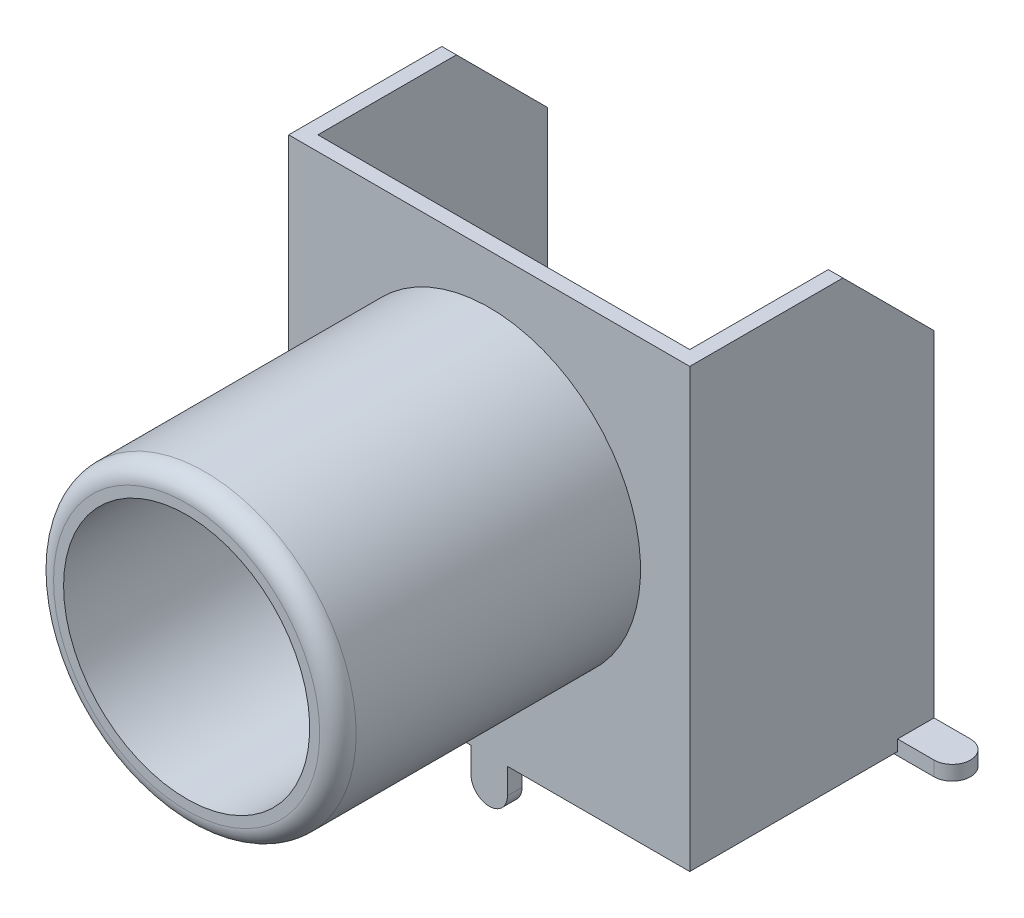
ISO-10303-21;
HEADER;
FILE_DESCRIPTION(('STEP AP214'),'2;1');
FILE_NAME('part.step','',(''),(''),'','','');
FILE_SCHEMA(('AUTOMOTIVE_DESIGN { 1 0 10303 214 1 1 1 1 }'));
ENDSEC;
DATA;
#1=APPLICATION_CONTEXT('core data for automotive mechanical design processes');
#2=APPLICATION_PROTOCOL_DEFINITION('international standard','automotive_design',2000,#1);
#3=PRODUCT_CONTEXT('',#1,'mechanical');
#4=PRODUCT('Part','Part','',(#3));
#5=PRODUCT_RELATED_PRODUCT_CATEGORY('part','',(#4));
#6=PRODUCT_DEFINITION_FORMATION('','',#4);
#7=PRODUCT_DEFINITION_CONTEXT('part definition',#1,'design');
#8=PRODUCT_DEFINITION('design','',#6,#7);
#9=PRODUCT_DEFINITION_SHAPE('','',#8);
#10=(LENGTH_UNIT() NAMED_UNIT(*) SI_UNIT(.MILLI.,.METRE.));
#11=(NAMED_UNIT(*) PLANE_ANGLE_UNIT() SI_UNIT($,.RADIAN.));
#12=(NAMED_UNIT(*) SI_UNIT($,.STERADIAN.) SOLID_ANGLE_UNIT());
#13=UNCERTAINTY_MEASURE_WITH_UNIT(LENGTH_MEASURE(1.E-05),#10,'distance_accuracy_value','');
#14=(GEOMETRIC_REPRESENTATION_CONTEXT(3) GLOBAL_UNCERTAINTY_ASSIGNED_CONTEXT((#13)) GLOBAL_UNIT_ASSIGNED_CONTEXT((#10,
#11,#12)) REPRESENTATION_CONTEXT('',''));
#15=CARTESIAN_POINT('',(0.,0.,0.));
#16=DIRECTION('',(0.,0.,1.));
#17=DIRECTION('',(1.,0.,0.));
#18=AXIS2_PLACEMENT_3D('',#15,#16,#17);
#19=CARTESIAN_POINT('',(6.5,5.5,-14.5));
#20=DIRECTION('',(0.,1.,0.));
#21=DIRECTION('',(0.,0.,1.));
#22=AXIS2_PLACEMENT_3D('',#19,#20,#21);
#23=CYLINDRICAL_SURFACE('',#22,0.5);
#24=DIRECTION('',(0.,1.,0.));
#25=VECTOR('',#24,1.);
#26=CARTESIAN_POINT('',(6.5,5.5,-15.));
#27=LINE('',#26,#25);
#28=CARTESIAN_POINT('',(6.5,-6.2,-15.));
#29=VERTEX_POINT('',#28);
#30=CARTESIAN_POINT('',(6.5,-6.6,-15.));
#31=VERTEX_POINT('',#30);
#32=EDGE_CURVE('E204',#29,#31,#27,.F.);
#33=ORIENTED_EDGE('',*,*,#32,.F.);
#34=CARTESIAN_POINT('',(6.5,-6.2,-14.5));
#35=DIRECTION('',(0.,1.,0.));
#36=DIRECTION('',(0.,0.,1.));
#37=AXIS2_PLACEMENT_3D('',#34,#35,#36);
#38=CIRCLE('',#37,0.5);
#39=CARTESIAN_POINT('',(6.5,-6.2,-14.));
#40=VERTEX_POINT('',#39);
#41=EDGE_CURVE('E188',#29,#40,#38,.F.);
#42=ORIENTED_EDGE('',*,*,#41,.T.);
#43=DIRECTION('',(0.,-1.,0.));
#44=VECTOR('',#43,1.);
#45=CARTESIAN_POINT('',(6.5,-6.2,-14.));
#46=LINE('',#45,#44);
#47=CARTESIAN_POINT('',(6.5,-6.6,-14.));
#48=VERTEX_POINT('',#47);
#49=EDGE_CURVE('E193',#48,#40,#46,.F.);
#50=ORIENTED_EDGE('',*,*,#49,.F.);
#51=CARTESIAN_POINT('',(6.5,-6.6,-14.5));
#52=DIRECTION('',(0.,1.,0.));
#53=DIRECTION('',(0.,0.,1.));
#54=AXIS2_PLACEMENT_3D('',#51,#52,#53);
#55=CIRCLE('',#54,0.5);
#56=EDGE_CURVE('E177',#31,#48,#55,.F.);
#57=ORIENTED_EDGE('',*,*,#56,.F.);
#58=EDGE_LOOP('',(#33,#42,#50,#57));
#59=FACE_BOUND('',#58,.T.);
#60=ADVANCED_FACE('F17',(#59),#23,.T.);
#61=CARTESIAN_POINT('',(5.1,-6.6,-15.));
#62=DIRECTION('',(0.,-1.,0.));
#63=DIRECTION('',(0.,0.,-1.));
#64=AXIS2_PLACEMENT_3D('',#61,#62,#63);
#65=PLANE('',#64);
#66=DIRECTION('',(-1.,0.,0.));
#67=VECTOR('',#66,1.);
#68=CARTESIAN_POINT('',(5.5,-6.6,-15.));
#69=LINE('',#68,#67);
#70=CARTESIAN_POINT('',(5.2,-6.6,-15.));
#71=VERTEX_POINT('',#70);
#72=EDGE_CURVE('E183',#31,#71,#69,.T.);
#73=ORIENTED_EDGE('',*,*,#72,.F.);
#74=ORIENTED_EDGE('',*,*,#56,.T.);
#75=DIRECTION('',(1.,0.,0.));
#76=VECTOR('',#75,1.);
#77=CARTESIAN_POINT('',(7.,-6.6,-14.));
#78=LINE('',#77,#76);
#79=CARTESIAN_POINT('',(5.2,-6.6,-14.));
#80=VERTEX_POINT('',#79);
#81=EDGE_CURVE('E181',#80,#48,#78,.T.);
#82=ORIENTED_EDGE('',*,*,#81,.F.);
#83=DIRECTION('',(0.,0.,1.));
#84=VECTOR('',#83,1.);
#85=CARTESIAN_POINT('',(5.2,-6.6,-15.));
#86=LINE('',#85,#84);
#87=EDGE_CURVE('E243',#71,#80,#86,.T.);
#88=ORIENTED_EDGE('',*,*,#87,.F.);
#89=EDGE_LOOP('',(#73,#74,#82,#88));
#90=FACE_BOUND('',#89,.T.);
#91=ADVANCED_FACE('F179',(#90),#65,.T.);
#92=CARTESIAN_POINT('',(5.1,-6.2,-15.));
#93=DIRECTION('',(0.,-1.,0.));
#94=DIRECTION('',(0.,0.,-1.));
#95=AXIS2_PLACEMENT_3D('',#92,#93,#94);
#96=PLANE('',#95);
#97=ORIENTED_EDGE('',*,*,#41,.F.);
#98=DIRECTION('',(-1.,0.,0.));
#99=VECTOR('',#98,1.);
#100=CARTESIAN_POINT('',(5.5,-6.2,-15.));
#101=LINE('',#100,#99);
#102=CARTESIAN_POINT('',(5.5,-6.2,-15.));
#103=VERTEX_POINT('',#102);
#104=EDGE_CURVE('E474',#103,#29,#101,.F.);
#105=ORIENTED_EDGE('',*,*,#104,.F.);
#106=DIRECTION('',(0.,0.,1.));
#107=VECTOR('',#106,1.);
#108=CARTESIAN_POINT('',(5.5,-6.2,-8.7));
#109=LINE('',#108,#107);
#110=CARTESIAN_POINT('',(5.5,-6.2,-14.));
#111=VERTEX_POINT('',#110);
#112=EDGE_CURVE('E482',#103,#111,#109,.T.);
#113=ORIENTED_EDGE('',*,*,#112,.T.);
#114=DIRECTION('',(1.,0.,0.));
#115=VECTOR('',#114,1.);
#116=CARTESIAN_POINT('',(7.,-6.2,-14.));
#117=LINE('',#116,#115);
#118=EDGE_CURVE('E200',#40,#111,#117,.F.);
#119=ORIENTED_EDGE('',*,*,#118,.F.);
#120=EDGE_LOOP('',(#97,#105,#113,#119));
#121=FACE_BOUND('',#120,.T.);
#122=ADVANCED_FACE('F529',(#121),#96,.F.);
#123=CARTESIAN_POINT('',(-5.1,-6.6,-15.));
#124=DIRECTION('',(0.,1.,0.));
#125=DIRECTION('',(0.,0.,1.));
#126=AXIS2_PLACEMENT_3D('',#123,#124,#125);
#127=PLANE('',#126);
#128=DIRECTION('',(0.,0.,1.));
#129=VECTOR('',#128,1.);
#130=CARTESIAN_POINT('',(-5.2,-6.6,-15.));
#131=LINE('',#130,#129);
#132=CARTESIAN_POINT('',(-5.2,-6.6,-14.));
#133=VERTEX_POINT('',#132);
#134=CARTESIAN_POINT('',(-5.2,-6.6,-15.));
#135=VERTEX_POINT('',#134);
#136=EDGE_CURVE('E239',#133,#135,#131,.F.);
#137=ORIENTED_EDGE('',*,*,#136,.F.);
#138=DIRECTION('',(1.,0.,0.));
#139=VECTOR('',#138,1.);
#140=CARTESIAN_POINT('',(-7.,-6.6,-14.));
#141=LINE('',#140,#139);
#142=CARTESIAN_POINT('',(-6.5,-6.6,-14.));
#143=VERTEX_POINT('',#142);
#144=EDGE_CURVE('E234',#143,#133,#141,.T.);
#145=ORIENTED_EDGE('',*,*,#144,.F.);
#146=CARTESIAN_POINT('',(-6.5,-6.6,-14.5));
#147=DIRECTION('',(0.,1.,0.));
#148=DIRECTION('',(0.,0.,1.));
#149=AXIS2_PLACEMENT_3D('',#146,#147,#148);
#150=CIRCLE('',#149,0.5);
#151=CARTESIAN_POINT('',(-6.5,-6.6,-15.));
#152=VERTEX_POINT('',#151);
#153=EDGE_CURVE('E246',#152,#143,#150,.T.);
#154=ORIENTED_EDGE('',*,*,#153,.F.);
#155=DIRECTION('',(-1.,0.,0.));
#156=VECTOR('',#155,1.);
#157=CARTESIAN_POINT('',(-5.5,-6.6,-15.));
#158=LINE('',#157,#156);
#159=EDGE_CURVE('E238',#135,#152,#158,.T.);
#160=ORIENTED_EDGE('',*,*,#159,.F.);
#161=EDGE_LOOP('',(#137,#145,#154,#160));
#162=FACE_BOUND('',#161,.T.);
#163=ADVANCED_FACE('F610',(#162),#127,.F.);
#164=CARTESIAN_POINT('',(-6.5,-6.2,-14.5));
#165=DIRECTION('',(0.,1.,0.));
#166=DIRECTION('',(0.,0.,1.));
#167=AXIS2_PLACEMENT_3D('',#164,#165,#166);
#168=CYLINDRICAL_SURFACE('',#167,0.5);
#169=CARTESIAN_POINT('',(-6.5,-6.2,-14.5));
#170=DIRECTION('',(0.,1.,0.));
#171=DIRECTION('',(0.,0.,1.));
#172=AXIS2_PLACEMENT_3D('',#169,#170,#171);
#173=CIRCLE('',#172,0.5);
#174=CARTESIAN_POINT('',(-6.5,-6.2,-15.));
#175=VERTEX_POINT('',#174);
#176=CARTESIAN_POINT('',(-6.5,-6.2,-14.));
#177=VERTEX_POINT('',#176);
#178=EDGE_CURVE('E197',#175,#177,#173,.T.);
#179=ORIENTED_EDGE('',*,*,#178,.F.);
#180=DIRECTION('',(0.,1.,0.));
#181=VECTOR('',#180,1.);
#182=CARTESIAN_POINT('',(-6.5,5.5,-15.));
#183=LINE('',#182,#181);
#184=EDGE_CURVE('E425',#152,#175,#183,.T.);
#185=ORIENTED_EDGE('',*,*,#184,.F.);
#186=ORIENTED_EDGE('',*,*,#153,.T.);
#187=DIRECTION('',(0.,1.,0.));
#188=VECTOR('',#187,1.);
#189=CARTESIAN_POINT('',(-6.5,-6.2,-14.));
#190=LINE('',#189,#188);
#191=EDGE_CURVE('E487',#177,#143,#190,.F.);
#192=ORIENTED_EDGE('',*,*,#191,.F.);
#193=EDGE_LOOP('',(#179,#185,#186,#192));
#194=FACE_BOUND('',#193,.T.);
#195=ADVANCED_FACE('F607',(#194),#168,.T.);
#196=CARTESIAN_POINT('',(-5.1,-6.2,-15.));
#197=DIRECTION('',(0.,1.,0.));
#198=DIRECTION('',(0.,0.,1.));
#199=AXIS2_PLACEMENT_3D('',#196,#197,#198);
#200=PLANE('',#199);
#201=DIRECTION('',(1.,0.,0.));
#202=VECTOR('',#201,1.);
#203=CARTESIAN_POINT('',(-7.,-6.2,-14.));
#204=LINE('',#203,#202);
#205=CARTESIAN_POINT('',(-5.5,-6.2,-14.));
#206=VERTEX_POINT('',#205);
#207=EDGE_CURVE('E233',#206,#177,#204,.F.);
#208=ORIENTED_EDGE('',*,*,#207,.F.);
#209=DIRECTION('',(0.,0.,-1.));
#210=VECTOR('',#209,1.);
#211=CARTESIAN_POINT('',(-5.5,-6.2,-8.7));
#212=LINE('',#211,#210);
#213=CARTESIAN_POINT('',(-5.5,-6.2,-15.));
#214=VERTEX_POINT('',#213);
#215=EDGE_CURVE('E396',#206,#214,#212,.T.);
#216=ORIENTED_EDGE('',*,*,#215,.T.);
#217=DIRECTION('',(-1.,0.,0.));
#218=VECTOR('',#217,1.);
#219=CARTESIAN_POINT('',(-5.5,-6.2,-15.));
#220=LINE('',#219,#218);
#221=EDGE_CURVE('E417',#175,#214,#220,.F.);
#222=ORIENTED_EDGE('',*,*,#221,.F.);
#223=ORIENTED_EDGE('',*,*,#178,.T.);
#224=EDGE_LOOP('',(#208,#216,#222,#223));
#225=FACE_BOUND('',#224,.T.);
#226=ADVANCED_FACE('F604',(#225),#200,.T.);
#227=CARTESIAN_POINT('',(7.,-6.2,-14.));
#228=DIRECTION('',(0.,0.,1.));
#229=DIRECTION('',(0.,-1.,0.));
#230=AXIS2_PLACEMENT_3D('',#227,#228,#229);
#231=PLANE('',#230);
#232=ORIENTED_EDGE('',*,*,#118,.T.);
#233=DIRECTION('',(0.,1.,0.));
#234=VECTOR('',#233,1.);
#235=CARTESIAN_POINT('',(5.5,5.5,-14.));
#236=LINE('',#235,#234);
#237=CARTESIAN_POINT('',(5.5,-6.5,-14.));
#238=VERTEX_POINT('',#237);
#239=EDGE_CURVE('E480',#111,#238,#236,.F.);
#240=ORIENTED_EDGE('',*,*,#239,.T.);
#241=DIRECTION('',(1.,0.,0.));
#242=VECTOR('',#241,1.);
#243=CARTESIAN_POINT('',(5.5,-6.5,-14.));
#244=LINE('',#243,#242);
#245=CARTESIAN_POINT('',(5.1,-6.5,-14.));
#246=VERTEX_POINT('',#245);
#247=EDGE_CURVE('E466',#238,#246,#244,.F.);
#248=ORIENTED_EDGE('',*,*,#247,.T.);
#249=CARTESIAN_POINT('',(5.2,-6.5,-14.));
#250=DIRECTION('',(0.,0.,1.));
#251=DIRECTION('',(1.,0.,0.));
#252=AXIS2_PLACEMENT_3D('',#249,#250,#251);
#253=CIRCLE('',#252,0.1);
#254=EDGE_CURVE('E196',#80,#246,#253,.F.);
#255=ORIENTED_EDGE('',*,*,#254,.F.);
#256=ORIENTED_EDGE('',*,*,#81,.T.);
#257=ORIENTED_EDGE('',*,*,#49,.T.);
#258=EDGE_LOOP('',(#232,#240,#248,#255,#256,#257));
#259=FACE_BOUND('',#258,.T.);
#260=ADVANCED_FACE('F192',(#259),#231,.T.);
#261=CARTESIAN_POINT('',(5.5,5.5,-15.));
#262=DIRECTION('',(0.,0.,-1.));
#263=DIRECTION('',(-1.,0.,0.));
#264=AXIS2_PLACEMENT_3D('',#261,#262,#263);
#265=PLANE('',#264);
#266=ORIENTED_EDGE('',*,*,#104,.T.);
#267=ORIENTED_EDGE('',*,*,#32,.T.);
#268=ORIENTED_EDGE('',*,*,#72,.T.);
#269=CARTESIAN_POINT('',(5.2,-6.5,-15.));
#270=DIRECTION('',(0.,0.,1.));
#271=DIRECTION('',(1.,0.,0.));
#272=AXIS2_PLACEMENT_3D('',#269,#270,#271);
#273=CIRCLE('',#272,0.1);
#274=CARTESIAN_POINT('',(5.1,-6.5,-15.));
#275=VERTEX_POINT('',#274);
#276=EDGE_CURVE('E240',#275,#71,#273,.T.);
#277=ORIENTED_EDGE('',*,*,#276,.F.);
#278=DIRECTION('',(0.,1.,0.));
#279=VECTOR('',#278,1.);
#280=CARTESIAN_POINT('',(5.1,5.5,-15.));
#281=LINE('',#280,#279);
#282=CARTESIAN_POINT('',(5.1,3.,-15.));
#283=VERTEX_POINT('',#282);
#284=EDGE_CURVE('E464',#283,#275,#281,.F.);
#285=ORIENTED_EDGE('',*,*,#284,.F.);
#286=DIRECTION('',(1.,0.,0.));
#287=VECTOR('',#286,1.);
#288=CARTESIAN_POINT('',(5.5,3.,-15.));
#289=LINE('',#288,#287);
#290=CARTESIAN_POINT('',(5.5,3.,-15.));
#291=VERTEX_POINT('',#290);
#292=EDGE_CURVE('E450',#291,#283,#289,.F.);
#293=ORIENTED_EDGE('',*,*,#292,.F.);
#294=DIRECTION('',(0.,1.,0.));
#295=VECTOR('',#294,1.);
#296=CARTESIAN_POINT('',(5.5,5.5,-15.));
#297=LINE('',#296,#295);
#298=EDGE_CURVE('E449',#291,#103,#297,.F.);
#299=ORIENTED_EDGE('',*,*,#298,.T.);
#300=EDGE_LOOP('',(#266,#267,#268,#277,#285,#293,#299));
#301=FACE_BOUND('',#300,.T.);
#302=ADVANCED_FACE('F525',(#301),#265,.T.);
#303=CARTESIAN_POINT('',(5.2,-6.5,-15.));
#304=DIRECTION('',(0.,0.,1.));
#305=DIRECTION('',(1.,0.,0.));
#306=AXIS2_PLACEMENT_3D('',#303,#304,#305);
#307=CYLINDRICAL_SURFACE('',#306,0.1);
#308=ORIENTED_EDGE('',*,*,#276,.T.);
#309=ORIENTED_EDGE('',*,*,#87,.T.);
#310=ORIENTED_EDGE('',*,*,#254,.T.);
#311=DIRECTION('',(0.,0.,1.));
#312=VECTOR('',#311,1.);
#313=CARTESIAN_POINT('',(5.1,-6.5,-15.));
#314=LINE('',#313,#312);
#315=EDGE_CURVE('E362',#275,#246,#314,.T.);
#316=ORIENTED_EDGE('',*,*,#315,.F.);
#317=EDGE_LOOP('',(#308,#309,#310,#316));
#318=FACE_BOUND('',#317,.T.);
#319=ADVANCED_FACE('F520',(#318),#307,.T.);
#320=CARTESIAN_POINT('',(5.5,3.,-15.));
#321=DIRECTION('',(0.,0.707106781186548,-0.707106781186548));
#322=DIRECTION('',(0.,0.707106781186548,0.707106781186548));
#323=AXIS2_PLACEMENT_3D('',#320,#321,#322);
#324=PLANE('',#323);
#325=DIRECTION('',(0.,-0.707106781186548,-0.707106781186547));
#326=VECTOR('',#325,1.);
#327=CARTESIAN_POINT('',(5.5,5.5,-12.5));
#328=LINE('',#327,#326);
#329=CARTESIAN_POINT('',(5.5,5.5,-12.5));
#330=VERTEX_POINT('',#329);
#331=EDGE_CURVE('E446',#330,#291,#328,.T.);
#332=ORIENTED_EDGE('',*,*,#331,.T.);
#333=ORIENTED_EDGE('',*,*,#292,.T.);
#334=DIRECTION('',(0.,-0.707106781186548,-0.707106781186547));
#335=VECTOR('',#334,1.);
#336=CARTESIAN_POINT('',(5.1,5.5,-12.5));
#337=LINE('',#336,#335);
#338=CARTESIAN_POINT('',(5.1,5.5,-12.5));
#339=VERTEX_POINT('',#338);
#340=EDGE_CURVE('E353',#339,#283,#337,.T.);
#341=ORIENTED_EDGE('',*,*,#340,.F.);
#342=DIRECTION('',(1.,0.,0.));
#343=VECTOR('',#342,1.);
#344=CARTESIAN_POINT('',(5.5,5.5,-12.5));
#345=LINE('',#344,#343);
#346=EDGE_CURVE('E457',#339,#330,#345,.T.);
#347=ORIENTED_EDGE('',*,*,#346,.T.);
#348=EDGE_LOOP('',(#332,#333,#341,#347));
#349=FACE_BOUND('',#348,.T.);
#350=ADVANCED_FACE('F555',(#349),#324,.T.);
#351=CARTESIAN_POINT('',(5.5,5.5,-8.7));
#352=DIRECTION('',(-1.,0.,0.));
#353=DIRECTION('',(0.,0.,1.));
#354=AXIS2_PLACEMENT_3D('',#351,#352,#353);
#355=PLANE('',#354);
#356=ORIENTED_EDGE('',*,*,#239,.F.);
#357=ORIENTED_EDGE('',*,*,#112,.F.);
#358=ORIENTED_EDGE('',*,*,#298,.F.);
#359=ORIENTED_EDGE('',*,*,#331,.F.);
#360=DIRECTION('',(0.,0.,-1.));
#361=VECTOR('',#360,1.);
#362=CARTESIAN_POINT('',(5.5,5.5,-8.7));
#363=LINE('',#362,#361);
#364=CARTESIAN_POINT('',(5.5,5.5,-8.3));
#365=VERTEX_POINT('',#364);
#366=EDGE_CURVE('E352',#330,#365,#363,.F.);
#367=ORIENTED_EDGE('',*,*,#366,.T.);
#368=DIRECTION('',(0.,1.,0.));
#369=VECTOR('',#368,1.);
#370=CARTESIAN_POINT('',(5.5,5.5,-8.3));
#371=LINE('',#370,#369);
#372=CARTESIAN_POINT('',(5.5,-6.5,-8.3));
#373=VERTEX_POINT('',#372);
#374=EDGE_CURVE('E405',#373,#365,#371,.T.);
#375=ORIENTED_EDGE('',*,*,#374,.F.);
#376=DIRECTION('',(0.,0.,1.));
#377=VECTOR('',#376,1.);
#378=CARTESIAN_POINT('',(5.5,-6.5,-8.7));
#379=LINE('',#378,#377);
#380=EDGE_CURVE('E368',#373,#238,#379,.F.);
#381=ORIENTED_EDGE('',*,*,#380,.T.);
#382=EDGE_LOOP('',(#356,#357,#358,#359,#367,#375,#381));
#383=FACE_BOUND('',#382,.T.);
#384=ADVANCED_FACE('F532',(#383),#355,.F.);
#385=CARTESIAN_POINT('',(-5.2,-6.5,-15.));
#386=DIRECTION('',(0.,0.,1.));
#387=DIRECTION('',(1.,0.,0.));
#388=AXIS2_PLACEMENT_3D('',#385,#386,#387);
#389=CYLINDRICAL_SURFACE('',#388,0.1);
#390=CARTESIAN_POINT('',(-5.2,-6.5,-14.));
#391=DIRECTION('',(0.,0.,1.));
#392=DIRECTION('',(1.,0.,0.));
#393=AXIS2_PLACEMENT_3D('',#390,#391,#392);
#394=CIRCLE('',#393,0.1);
#395=CARTESIAN_POINT('',(-5.1,-6.5,-14.));
#396=VERTEX_POINT('',#395);
#397=EDGE_CURVE('E231',#133,#396,#394,.T.);
#398=ORIENTED_EDGE('',*,*,#397,.F.);
#399=ORIENTED_EDGE('',*,*,#136,.T.);
#400=CARTESIAN_POINT('',(-5.2,-6.5,-15.));
#401=DIRECTION('',(0.,0.,1.));
#402=DIRECTION('',(1.,0.,0.));
#403=AXIS2_PLACEMENT_3D('',#400,#401,#402);
#404=CIRCLE('',#403,0.1);
#405=CARTESIAN_POINT('',(-5.1,-6.5,-15.));
#406=VERTEX_POINT('',#405);
#407=EDGE_CURVE('E235',#406,#135,#404,.F.);
#408=ORIENTED_EDGE('',*,*,#407,.F.);
#409=DIRECTION('',(0.,0.,-1.));
#410=VECTOR('',#409,1.);
#411=CARTESIAN_POINT('',(-5.1,-6.5,-15.));
#412=LINE('',#411,#410);
#413=EDGE_CURVE('E400',#396,#406,#412,.T.);
#414=ORIENTED_EDGE('',*,*,#413,.F.);
#415=EDGE_LOOP('',(#398,#399,#408,#414));
#416=FACE_BOUND('',#415,.T.);
#417=ADVANCED_FACE('F598',(#416),#389,.T.);
#418=CARTESIAN_POINT('',(-5.5,5.5,-15.));
#419=DIRECTION('',(0.,0.,-1.));
#420=DIRECTION('',(-1.,0.,0.));
#421=AXIS2_PLACEMENT_3D('',#418,#419,#420);
#422=PLANE('',#421);
#423=DIRECTION('',(0.,1.,0.));
#424=VECTOR('',#423,1.);
#425=CARTESIAN_POINT('',(-5.5,5.5,-15.));
#426=LINE('',#425,#424);
#427=CARTESIAN_POINT('',(-5.5,3.,-15.));
#428=VERTEX_POINT('',#427);
#429=EDGE_CURVE('E432',#214,#428,#426,.T.);
#430=ORIENTED_EDGE('',*,*,#429,.T.);
#431=DIRECTION('',(1.,0.,0.));
#432=VECTOR('',#431,1.);
#433=CARTESIAN_POINT('',(-5.5,3.,-15.));
#434=LINE('',#433,#432);
#435=CARTESIAN_POINT('',(-5.1,3.,-15.));
#436=VERTEX_POINT('',#435);
#437=EDGE_CURVE('E384',#436,#428,#434,.F.);
#438=ORIENTED_EDGE('',*,*,#437,.F.);
#439=DIRECTION('',(0.,1.,0.));
#440=VECTOR('',#439,1.);
#441=CARTESIAN_POINT('',(-5.1,5.5,-15.));
#442=LINE('',#441,#440);
#443=EDGE_CURVE('E402',#406,#436,#442,.T.);
#444=ORIENTED_EDGE('',*,*,#443,.F.);
#445=ORIENTED_EDGE('',*,*,#407,.T.);
#446=ORIENTED_EDGE('',*,*,#159,.T.);
#447=ORIENTED_EDGE('',*,*,#184,.T.);
#448=ORIENTED_EDGE('',*,*,#221,.T.);
#449=EDGE_LOOP('',(#430,#438,#444,#445,#446,#447,#448));
#450=FACE_BOUND('',#449,.T.);
#451=ADVANCED_FACE('F601',(#450),#422,.T.);
#452=CARTESIAN_POINT('',(-5.5,3.,-15.));
#453=DIRECTION('',(0.,0.707106781186548,-0.707106781186548));
#454=DIRECTION('',(0.,0.707106781186548,0.707106781186548));
#455=AXIS2_PLACEMENT_3D('',#452,#453,#454);
#456=PLANE('',#455);
#457=DIRECTION('',(0.,0.707106781186548,0.707106781186547));
#458=VECTOR('',#457,1.);
#459=CARTESIAN_POINT('',(-5.1,3.,-15.));
#460=LINE('',#459,#458);
#461=CARTESIAN_POINT('',(-5.1,5.5,-12.5));
#462=VERTEX_POINT('',#461);
#463=EDGE_CURVE('E342',#436,#462,#460,.T.);
#464=ORIENTED_EDGE('',*,*,#463,.F.);
#465=ORIENTED_EDGE('',*,*,#437,.T.);
#466=DIRECTION('',(0.,0.707106781186548,0.707106781186547));
#467=VECTOR('',#466,1.);
#468=CARTESIAN_POINT('',(-5.5,3.,-15.));
#469=LINE('',#468,#467);
#470=CARTESIAN_POINT('',(-5.5,5.5,-12.5));
#471=VERTEX_POINT('',#470);
#472=EDGE_CURVE('E397',#428,#471,#469,.T.);
#473=ORIENTED_EDGE('',*,*,#472,.T.);
#474=DIRECTION('',(1.,0.,0.));
#475=VECTOR('',#474,1.);
#476=CARTESIAN_POINT('',(5.5,5.5,-12.5));
#477=LINE('',#476,#475);
#478=EDGE_CURVE('E403',#471,#462,#477,.T.);
#479=ORIENTED_EDGE('',*,*,#478,.T.);
#480=EDGE_LOOP('',(#464,#465,#473,#479));
#481=FACE_BOUND('',#480,.T.);
#482=ADVANCED_FACE('F586',(#481),#456,.T.);
#483=CARTESIAN_POINT('',(-7.,-6.2,-14.));
#484=DIRECTION('',(0.,0.,1.));
#485=DIRECTION('',(1.,0.,0.));
#486=AXIS2_PLACEMENT_3D('',#483,#484,#485);
#487=PLANE('',#486);
#488=ORIENTED_EDGE('',*,*,#207,.T.);
#489=ORIENTED_EDGE('',*,*,#191,.T.);
#490=ORIENTED_EDGE('',*,*,#144,.T.);
#491=ORIENTED_EDGE('',*,*,#397,.T.);
#492=DIRECTION('',(1.,0.,0.));
#493=VECTOR('',#492,1.);
#494=CARTESIAN_POINT('',(5.5,-6.5,-14.));
#495=LINE('',#494,#493);
#496=CARTESIAN_POINT('',(-5.5,-6.5,-14.));
#497=VERTEX_POINT('',#496);
#498=EDGE_CURVE('E331',#396,#497,#495,.F.);
#499=ORIENTED_EDGE('',*,*,#498,.T.);
#500=DIRECTION('',(0.,1.,0.));
#501=VECTOR('',#500,1.);
#502=CARTESIAN_POINT('',(-5.5,5.5,-14.));
#503=LINE('',#502,#501);
#504=EDGE_CURVE('E393',#497,#206,#503,.T.);
#505=ORIENTED_EDGE('',*,*,#504,.T.);
#506=EDGE_LOOP('',(#488,#489,#490,#491,#499,#505));
#507=FACE_BOUND('',#506,.T.);
#508=ADVANCED_FACE('F593',(#507),#487,.T.);
#509=CARTESIAN_POINT('',(-5.5,5.5,-8.7));
#510=DIRECTION('',(1.,0.,0.));
#511=DIRECTION('',(0.,0.,-1.));
#512=AXIS2_PLACEMENT_3D('',#509,#510,#511);
#513=PLANE('',#512);
#514=ORIENTED_EDGE('',*,*,#504,.F.);
#515=DIRECTION('',(0.,0.,1.));
#516=VECTOR('',#515,1.);
#517=CARTESIAN_POINT('',(-5.5,-6.5,-8.7));
#518=LINE('',#517,#516);
#519=CARTESIAN_POINT('',(-5.5,-6.5,-8.3));
#520=VERTEX_POINT('',#519);
#521=EDGE_CURVE('E376',#497,#520,#518,.T.);
#522=ORIENTED_EDGE('',*,*,#521,.T.);
#523=DIRECTION('',(0.,1.,0.));
#524=VECTOR('',#523,1.);
#525=CARTESIAN_POINT('',(-5.5,5.5,-8.3));
#526=LINE('',#525,#524);
#527=CARTESIAN_POINT('',(-5.5,5.5,-8.3));
#528=VERTEX_POINT('',#527);
#529=EDGE_CURVE('E369',#528,#520,#526,.F.);
#530=ORIENTED_EDGE('',*,*,#529,.F.);
#531=DIRECTION('',(0.,0.,-1.));
#532=VECTOR('',#531,1.);
#533=CARTESIAN_POINT('',(-5.5,5.5,-8.7));
#534=LINE('',#533,#532);
#535=EDGE_CURVE('E410',#528,#471,#534,.T.);
#536=ORIENTED_EDGE('',*,*,#535,.T.);
#537=ORIENTED_EDGE('',*,*,#472,.F.);
#538=ORIENTED_EDGE('',*,*,#429,.F.);
#539=ORIENTED_EDGE('',*,*,#215,.F.);
#540=EDGE_LOOP('',(#514,#522,#530,#536,#537,#538,#539));
#541=FACE_BOUND('',#540,.T.);
#542=ADVANCED_FACE('F589',(#541),#513,.F.);
#543=CARTESIAN_POINT('',(-5.5,5.5,-8.3));
#544=DIRECTION('',(0.,0.,1.));
#545=DIRECTION('',(1.,0.,0.));
#546=AXIS2_PLACEMENT_3D('',#543,#544,#545);
#547=PLANE('',#546);
#548=CARTESIAN_POINT('',(0.,0.,-8.3));
#549=DIRECTION('',(0.,0.,-1.));
#550=DIRECTION('',(-1.,0.,0.));
#551=AXIS2_PLACEMENT_3D('',#548,#549,#550);
#552=CIRCLE('',#551,4.15);
#553=CARTESIAN_POINT('',(-4.15,0.,-8.3));
#554=VERTEX_POINT('',#553);
#555=EDGE_CURVE('E222',#554,#554,#552,.F.);
#556=ORIENTED_EDGE('',*,*,#555,.F.);
#557=EDGE_LOOP('',(#556));
#558=FACE_BOUND('',#557,.T.);
#559=DIRECTION('',(1.,0.,0.));
#560=VECTOR('',#559,1.);
#561=CARTESIAN_POINT('',(5.5,-6.5,-8.3));
#562=LINE('',#561,#560);
#563=CARTESIAN_POINT('',(-0.5,-6.5,-8.3));
#564=VERTEX_POINT('',#563);
#565=EDGE_CURVE('E332',#520,#564,#562,.T.);
#566=ORIENTED_EDGE('',*,*,#565,.T.);
#567=DIRECTION('',(0.,-1.,0.));
#568=VECTOR('',#567,1.);
#569=CARTESIAN_POINT('',(-0.5,-6.5,-8.3));
#570=LINE('',#569,#568);
#571=CARTESIAN_POINT('',(-0.5,-7.2,-8.3));
#572=VERTEX_POINT('',#571);
#573=EDGE_CURVE('E320',#572,#564,#570,.F.);
#574=ORIENTED_EDGE('',*,*,#573,.F.);
#575=CARTESIAN_POINT('',(0.,-7.2,-8.3));
#576=DIRECTION('',(0.,0.,-1.));
#577=DIRECTION('',(-1.,0.,0.));
#578=AXIS2_PLACEMENT_3D('',#575,#576,#577);
#579=CIRCLE('',#578,0.5);
#580=CARTESIAN_POINT('',(0.5,-7.2,-8.3));
#581=VERTEX_POINT('',#580);
#582=EDGE_CURVE('E227',#581,#572,#579,.T.);
#583=ORIENTED_EDGE('',*,*,#582,.F.);
#584=DIRECTION('',(0.,1.,0.));
#585=VECTOR('',#584,1.);
#586=CARTESIAN_POINT('',(0.5,-7.7,-8.3));
#587=LINE('',#586,#585);
#588=CARTESIAN_POINT('',(0.5,-6.5,-8.3));
#589=VERTEX_POINT('',#588);
#590=EDGE_CURVE('E229',#589,#581,#587,.F.);
#591=ORIENTED_EDGE('',*,*,#590,.F.);
#592=DIRECTION('',(1.,0.,0.));
#593=VECTOR('',#592,1.);
#594=CARTESIAN_POINT('',(5.5,-6.5,-8.3));
#595=LINE('',#594,#593);
#596=EDGE_CURVE('E365',#589,#373,#595,.T.);
#597=ORIENTED_EDGE('',*,*,#596,.T.);
#598=ORIENTED_EDGE('',*,*,#374,.T.);
#599=DIRECTION('',(1.,0.,0.));
#600=VECTOR('',#599,1.);
#601=CARTESIAN_POINT('',(5.5,5.5,-8.3));
#602=LINE('',#601,#600);
#603=EDGE_CURVE('E428',#365,#528,#602,.F.);
#604=ORIENTED_EDGE('',*,*,#603,.T.);
#605=ORIENTED_EDGE('',*,*,#529,.T.);
#606=EDGE_LOOP('',(#566,#574,#583,#591,#597,#598,#604,#605));
#607=FACE_BOUND('',#606,.T.);
#608=ADVANCED_FACE('F559',(#558,#607),#547,.T.);
#609=CARTESIAN_POINT('',(5.5,-6.5,-8.7));
#610=DIRECTION('',(0.,1.,0.));
#611=DIRECTION('',(0.,0.,1.));
#612=AXIS2_PLACEMENT_3D('',#609,#610,#611);
#613=PLANE('',#612);
#614=ORIENTED_EDGE('',*,*,#247,.F.);
#615=ORIENTED_EDGE('',*,*,#380,.F.);
#616=ORIENTED_EDGE('',*,*,#596,.F.);
#617=DIRECTION('',(0.,0.,-1.));
#618=VECTOR('',#617,1.);
#619=CARTESIAN_POINT('',(0.5,-6.5,-8.7));
#620=LINE('',#619,#618);
#621=CARTESIAN_POINT('',(0.5,-6.5,-8.7));
#622=VERTEX_POINT('',#621);
#623=EDGE_CURVE('E226',#622,#589,#620,.F.);
#624=ORIENTED_EDGE('',*,*,#623,.F.);
#625=DIRECTION('',(1.,0.,0.));
#626=VECTOR('',#625,1.);
#627=CARTESIAN_POINT('',(-5.5,-6.5,-8.7));
#628=LINE('',#627,#626);
#629=CARTESIAN_POINT('',(5.1,-6.5,-8.7));
#630=VERTEX_POINT('',#629);
#631=EDGE_CURVE('E225',#622,#630,#628,.T.);
#632=ORIENTED_EDGE('',*,*,#631,.T.);
#633=DIRECTION('',(0.,0.,1.));
#634=VECTOR('',#633,1.);
#635=CARTESIAN_POINT('',(5.1,-6.5,-15.));
#636=LINE('',#635,#634);
#637=EDGE_CURVE('E360',#246,#630,#636,.T.);
#638=ORIENTED_EDGE('',*,*,#637,.F.);
#639=EDGE_LOOP('',(#614,#615,#616,#624,#632,#638));
#640=FACE_BOUND('',#639,.T.);
#641=ADVANCED_FACE('F538',(#640),#613,.F.);
#642=CARTESIAN_POINT('',(5.1,5.5,-15.));
#643=DIRECTION('',(-1.,0.,0.));
#644=DIRECTION('',(0.,0.,1.));
#645=AXIS2_PLACEMENT_3D('',#642,#643,#644);
#646=PLANE('',#645);
#647=DIRECTION('',(0.,0.,-1.));
#648=VECTOR('',#647,1.);
#649=CARTESIAN_POINT('',(5.1,5.5,-8.7));
#650=LINE('',#649,#648);
#651=CARTESIAN_POINT('',(5.1,5.5,-8.7));
#652=VERTEX_POINT('',#651);
#653=EDGE_CURVE('E349',#652,#339,#650,.T.);
#654=ORIENTED_EDGE('',*,*,#653,.T.);
#655=ORIENTED_EDGE('',*,*,#340,.T.);
#656=ORIENTED_EDGE('',*,*,#284,.T.);
#657=ORIENTED_EDGE('',*,*,#315,.T.);
#658=ORIENTED_EDGE('',*,*,#637,.T.);
#659=DIRECTION('',(0.,1.,0.));
#660=VECTOR('',#659,1.);
#661=CARTESIAN_POINT('',(5.1,5.5,-8.7));
#662=LINE('',#661,#660);
#663=EDGE_CURVE('E313',#630,#652,#662,.T.);
#664=ORIENTED_EDGE('',*,*,#663,.T.);
#665=EDGE_LOOP('',(#654,#655,#656,#657,#658,#664));
#666=FACE_BOUND('',#665,.T.);
#667=ADVANCED_FACE('F542',(#666),#646,.T.);
#668=CARTESIAN_POINT('',(5.5,5.5,-8.7));
#669=DIRECTION('',(0.,-1.,0.));
#670=DIRECTION('',(0.,0.,-1.));
#671=AXIS2_PLACEMENT_3D('',#668,#669,#670);
#672=PLANE('',#671);
#673=ORIENTED_EDGE('',*,*,#478,.F.);
#674=ORIENTED_EDGE('',*,*,#535,.F.);
#675=ORIENTED_EDGE('',*,*,#603,.F.);
#676=ORIENTED_EDGE('',*,*,#366,.F.);
#677=ORIENTED_EDGE('',*,*,#346,.F.);
#678=ORIENTED_EDGE('',*,*,#653,.F.);
#679=DIRECTION('',(1.,0.,0.));
#680=VECTOR('',#679,1.);
#681=CARTESIAN_POINT('',(-5.5,5.5,-8.7));
#682=LINE('',#681,#680);
#683=CARTESIAN_POINT('',(-5.1,5.5,-8.7));
#684=VERTEX_POINT('',#683);
#685=EDGE_CURVE('E337',#652,#684,#682,.F.);
#686=ORIENTED_EDGE('',*,*,#685,.T.);
#687=DIRECTION('',(0.,0.,-1.));
#688=VECTOR('',#687,1.);
#689=CARTESIAN_POINT('',(-5.1,5.5,-15.));
#690=LINE('',#689,#688);
#691=EDGE_CURVE('E340',#462,#684,#690,.F.);
#692=ORIENTED_EDGE('',*,*,#691,.F.);
#693=EDGE_LOOP('',(#673,#674,#675,#676,#677,#678,#686,#692));
#694=FACE_BOUND('',#693,.T.);
#695=ADVANCED_FACE('F551',(#694),#672,.F.);
#696=CARTESIAN_POINT('',(-5.1,5.5,-15.));
#697=DIRECTION('',(1.,0.,0.));
#698=DIRECTION('',(0.,0.,-1.));
#699=AXIS2_PLACEMENT_3D('',#696,#697,#698);
#700=PLANE('',#699);
#701=ORIENTED_EDGE('',*,*,#691,.T.);
#702=DIRECTION('',(0.,1.,0.));
#703=VECTOR('',#702,1.);
#704=CARTESIAN_POINT('',(-5.1,5.5,-8.7));
#705=LINE('',#704,#703);
#706=CARTESIAN_POINT('',(-5.1,-6.5,-8.7));
#707=VERTEX_POINT('',#706);
#708=EDGE_CURVE('E325',#684,#707,#705,.F.);
#709=ORIENTED_EDGE('',*,*,#708,.T.);
#710=DIRECTION('',(0.,0.,1.));
#711=VECTOR('',#710,1.);
#712=CARTESIAN_POINT('',(-5.1,-6.5,-8.7));
#713=LINE('',#712,#711);
#714=EDGE_CURVE('E328',#707,#396,#713,.F.);
#715=ORIENTED_EDGE('',*,*,#714,.T.);
#716=ORIENTED_EDGE('',*,*,#413,.T.);
#717=ORIENTED_EDGE('',*,*,#443,.T.);
#718=ORIENTED_EDGE('',*,*,#463,.T.);
#719=EDGE_LOOP('',(#701,#709,#715,#716,#717,#718));
#720=FACE_BOUND('',#719,.T.);
#721=ADVANCED_FACE('F579',(#720),#700,.T.);
#722=CARTESIAN_POINT('',(5.5,-6.5,-8.7));
#723=DIRECTION('',(0.,1.,0.));
#724=DIRECTION('',(0.,0.,1.));
#725=AXIS2_PLACEMENT_3D('',#722,#723,#724);
#726=PLANE('',#725);
#727=ORIENTED_EDGE('',*,*,#498,.F.);
#728=ORIENTED_EDGE('',*,*,#714,.F.);
#729=DIRECTION('',(1.,0.,0.));
#730=VECTOR('',#729,1.);
#731=CARTESIAN_POINT('',(-5.5,-6.5,-8.7));
#732=LINE('',#731,#730);
#733=CARTESIAN_POINT('',(-0.5,-6.5,-8.7));
#734=VERTEX_POINT('',#733);
#735=EDGE_CURVE('E300',#707,#734,#732,.T.);
#736=ORIENTED_EDGE('',*,*,#735,.T.);
#737=DIRECTION('',(0.,0.,1.));
#738=VECTOR('',#737,1.);
#739=CARTESIAN_POINT('',(-0.5,-6.5,-8.7));
#740=LINE('',#739,#738);
#741=EDGE_CURVE('E318',#564,#734,#740,.F.);
#742=ORIENTED_EDGE('',*,*,#741,.F.);
#743=ORIENTED_EDGE('',*,*,#565,.F.);
#744=ORIENTED_EDGE('',*,*,#521,.F.);
#745=EDGE_LOOP('',(#727,#728,#736,#742,#743,#744));
#746=FACE_BOUND('',#745,.T.);
#747=ADVANCED_FACE('F576',(#746),#726,.F.);
#748=CARTESIAN_POINT('',(-0.5,-6.5,-8.7));
#749=DIRECTION('',(-1.,0.,0.));
#750=DIRECTION('',(0.,-1.,0.));
#751=AXIS2_PLACEMENT_3D('',#748,#749,#750);
#752=PLANE('',#751);
#753=ORIENTED_EDGE('',*,*,#573,.T.);
#754=ORIENTED_EDGE('',*,*,#741,.T.);
#755=DIRECTION('',(0.,1.,0.));
#756=VECTOR('',#755,1.);
#757=CARTESIAN_POINT('',(-0.5,5.5,-8.7));
#758=LINE('',#757,#756);
#759=CARTESIAN_POINT('',(-0.5,-7.2,-8.7));
#760=VERTEX_POINT('',#759);
#761=EDGE_CURVE('E221',#734,#760,#758,.F.);
#762=ORIENTED_EDGE('',*,*,#761,.T.);
#763=DIRECTION('',(0.,0.,-1.));
#764=VECTOR('',#763,1.);
#765=CARTESIAN_POINT('',(-0.5,-7.2,-8.7));
#766=LINE('',#765,#764);
#767=EDGE_CURVE('E230',#572,#760,#766,.T.);
#768=ORIENTED_EDGE('',*,*,#767,.F.);
#769=EDGE_LOOP('',(#753,#754,#762,#768));
#770=FACE_BOUND('',#769,.T.);
#771=ADVANCED_FACE('F572',(#770),#752,.T.);
#772=CARTESIAN_POINT('',(0.,-7.2,-8.7));
#773=DIRECTION('',(0.,0.,-1.));
#774=DIRECTION('',(-1.,0.,0.));
#775=AXIS2_PLACEMENT_3D('',#772,#773,#774);
#776=CYLINDRICAL_SURFACE('',#775,0.5);
#777=ORIENTED_EDGE('',*,*,#582,.T.);
#778=ORIENTED_EDGE('',*,*,#767,.T.);
#779=CARTESIAN_POINT('',(0.,-7.2,-8.7));
#780=DIRECTION('',(0.,0.,-1.));
#781=DIRECTION('',(-1.,0.,0.));
#782=AXIS2_PLACEMENT_3D('',#779,#780,#781);
#783=CIRCLE('',#782,0.5);
#784=CARTESIAN_POINT('',(0.5,-7.2,-8.7));
#785=VERTEX_POINT('',#784);
#786=EDGE_CURVE('E217',#760,#785,#783,.F.);
#787=ORIENTED_EDGE('',*,*,#786,.T.);
#788=DIRECTION('',(0.,0.,-1.));
#789=VECTOR('',#788,1.);
#790=CARTESIAN_POINT('',(0.5,-7.2,-8.7));
#791=LINE('',#790,#789);
#792=EDGE_CURVE('E305',#581,#785,#791,.T.);
#793=ORIENTED_EDGE('',*,*,#792,.F.);
#794=EDGE_LOOP('',(#777,#778,#787,#793));
#795=FACE_BOUND('',#794,.T.);
#796=ADVANCED_FACE('F568',(#795),#776,.T.);
#797=CARTESIAN_POINT('',(0.5,-7.7,-8.7));
#798=DIRECTION('',(1.,0.,0.));
#799=DIRECTION('',(0.,0.,-1.));
#800=AXIS2_PLACEMENT_3D('',#797,#798,#799);
#801=PLANE('',#800);
#802=DIRECTION('',(0.,1.,0.));
#803=VECTOR('',#802,1.);
#804=CARTESIAN_POINT('',(0.5,5.5,-8.7));
#805=LINE('',#804,#803);
#806=EDGE_CURVE('E220',#785,#622,#805,.T.);
#807=ORIENTED_EDGE('',*,*,#806,.T.);
#808=ORIENTED_EDGE('',*,*,#623,.T.);
#809=ORIENTED_EDGE('',*,*,#590,.T.);
#810=ORIENTED_EDGE('',*,*,#792,.T.);
#811=EDGE_LOOP('',(#807,#808,#809,#810));
#812=FACE_BOUND('',#811,.T.);
#813=ADVANCED_FACE('F564',(#812),#801,.T.);
#814=CARTESIAN_POINT('',(0.,0.,-9.7));
#815=DIRECTION('',(0.,0.,-1.));
#816=DIRECTION('',(-1.,0.,0.));
#817=AXIS2_PLACEMENT_3D('',#814,#815,#816);
#818=CYLINDRICAL_SURFACE('',#817,4.15);
#819=ORIENTED_EDGE('',*,*,#555,.T.);
#820=EDGE_LOOP('',(#819));
#821=FACE_BOUND('',#820,.T.);
#822=CARTESIAN_POINT('',(0.,0.,-0.5));
#823=DIRECTION('',(0.,0.,1.));
#824=DIRECTION('',(1.,0.,0.));
#825=AXIS2_PLACEMENT_3D('',#822,#823,#824);
#826=CIRCLE('',#825,4.15);
#827=CARTESIAN_POINT('',(4.15,0.,-0.5));
#828=VERTEX_POINT('',#827);
#829=EDGE_CURVE('E216',#828,#828,#826,.T.);
#830=ORIENTED_EDGE('',*,*,#829,.F.);
#831=EDGE_LOOP('',(#830));
#832=FACE_BOUND('',#831,.T.);
#833=ADVANCED_FACE('F655',(#821,#832),#818,.T.);
#834=CARTESIAN_POINT('',(-5.5,5.5,-8.7));
#835=DIRECTION('',(0.,0.,1.));
#836=DIRECTION('',(1.,0.,0.));
#837=AXIS2_PLACEMENT_3D('',#834,#835,#836);
#838=PLANE('',#837);
#839=CARTESIAN_POINT('',(0.,0.,-8.7));
#840=DIRECTION('',(0.,0.,-1.));
#841=DIRECTION('',(-1.,0.,0.));
#842=AXIS2_PLACEMENT_3D('',#839,#840,#841);
#843=CIRCLE('',#842,4.15);
#844=CARTESIAN_POINT('',(-4.15,0.,-8.7));
#845=VERTEX_POINT('',#844);
#846=EDGE_CURVE('E213',#845,#845,#843,.T.);
#847=ORIENTED_EDGE('',*,*,#846,.F.);
#848=EDGE_LOOP('',(#847));
#849=FACE_BOUND('',#848,.T.);
#850=ORIENTED_EDGE('',*,*,#786,.F.);
#851=ORIENTED_EDGE('',*,*,#761,.F.);
#852=ORIENTED_EDGE('',*,*,#735,.F.);
#853=ORIENTED_EDGE('',*,*,#708,.F.);
#854=ORIENTED_EDGE('',*,*,#685,.F.);
#855=ORIENTED_EDGE('',*,*,#663,.F.);
#856=ORIENTED_EDGE('',*,*,#631,.F.);
#857=ORIENTED_EDGE('',*,*,#806,.F.);
#858=EDGE_LOOP('',(#850,#851,#852,#853,#854,#855,#856,#857));
#859=FACE_BOUND('',#858,.T.);
#860=ADVANCED_FACE('F281',(#849,#859),#838,.F.);
#861=CARTESIAN_POINT('',(0.,0.,-0.5));
#862=DIRECTION('',(0.,0.,1.));
#863=DIRECTION('',(1.,0.,0.));
#864=AXIS2_PLACEMENT_3D('',#861,#862,#863);
#865=TOROIDAL_SURFACE('',#864,3.65,0.5);
#866=ORIENTED_EDGE('',*,*,#829,.T.);
#867=EDGE_LOOP('',(#866));
#868=FACE_BOUND('',#867,.T.);
#869=CARTESIAN_POINT('',(0.,0.,0.));
#870=DIRECTION('',(0.,0.,-1.));
#871=DIRECTION('',(1.,0.,0.));
#872=AXIS2_PLACEMENT_3D('',#869,#870,#871);
#873=CIRCLE('',#872,3.65);
#874=CARTESIAN_POINT('',(-3.65,0.,0.));
#875=VERTEX_POINT('',#874);
#876=CARTESIAN_POINT('',(3.65,0.,0.));
#877=VERTEX_POINT('',#876);
#878=EDGE_CURVE('E212',#875,#877,#873,.F.);
#879=ORIENTED_EDGE('',*,*,#878,.F.);
#880=CARTESIAN_POINT('',(0.,0.,0.));
#881=DIRECTION('',(0.,0.,-1.));
#882=DIRECTION('',(-1.,0.,0.));
#883=AXIS2_PLACEMENT_3D('',#880,#881,#882);
#884=CIRCLE('',#883,3.65);
#885=EDGE_CURVE('E36',#877,#875,#884,.F.);
#886=ORIENTED_EDGE('',*,*,#885,.F.);
#887=EDGE_LOOP('',(#879,#886));
#888=FACE_BOUND('',#887,.T.);
#889=ADVANCED_FACE('F249',(#868,#888),#865,.T.);
#890=CARTESIAN_POINT('',(0.,0.,-9.7));
#891=DIRECTION('',(0.,0.,-1.));
#892=DIRECTION('',(-1.,0.,0.));
#893=AXIS2_PLACEMENT_3D('',#890,#891,#892);
#894=CYLINDRICAL_SURFACE('',#893,4.15);
#895=ORIENTED_EDGE('',*,*,#846,.T.);
#896=EDGE_LOOP('',(#895));
#897=FACE_BOUND('',#896,.T.);
#898=CARTESIAN_POINT('',(0.,0.,-9.7));
#899=DIRECTION('',(0.,0.,-1.));
#900=DIRECTION('',(-1.,0.,0.));
#901=AXIS2_PLACEMENT_3D('',#898,#899,#900);
#902=CIRCLE('',#901,4.15);
#903=CARTESIAN_POINT('',(-4.15,0.,-9.7));
#904=VERTEX_POINT('',#903);
#905=EDGE_CURVE('E209',#904,#904,#902,.F.);
#906=ORIENTED_EDGE('',*,*,#905,.T.);
#907=EDGE_LOOP('',(#906));
#908=FACE_BOUND('',#907,.T.);
#909=ADVANCED_FACE('F272',(#897,#908),#894,.T.);
#910=CARTESIAN_POINT('',(0.,0.,0.));
#911=DIRECTION('',(0.,0.,1.));
#912=DIRECTION('',(1.,0.,0.));
#913=AXIS2_PLACEMENT_3D('',#910,#911,#912);
#914=PLANE('',#913);
#915=CARTESIAN_POINT('',(0.,0.,0.));
#916=DIRECTION('',(0.,0.,-1.));
#917=DIRECTION('',(-1.,0.,0.));
#918=AXIS2_PLACEMENT_3D('',#915,#916,#917);
#919=CIRCLE('',#918,3.375);
#920=CARTESIAN_POINT('',(-3.375,0.,0.));
#921=VERTEX_POINT('',#920);
#922=EDGE_CURVE('E28',#921,#921,#919,.T.);
#923=ORIENTED_EDGE('',*,*,#922,.T.);
#924=EDGE_LOOP('',(#923));
#925=FACE_BOUND('',#924,.T.);
#926=ORIENTED_EDGE('',*,*,#885,.T.);
#927=ORIENTED_EDGE('',*,*,#878,.T.);
#928=EDGE_LOOP('',(#926,#927));
#929=FACE_BOUND('',#928,.T.);
#930=ADVANCED_FACE('F252',(#925,#929),#914,.T.);
#931=CARTESIAN_POINT('',(0.,0.,-9.7));
#932=DIRECTION('',(0.,0.,1.));
#933=DIRECTION('',(1.,0.,0.));
#934=AXIS2_PLACEMENT_3D('',#931,#932,#933);
#935=PLANE('',#934);
#936=CARTESIAN_POINT('',(0.,0.,-9.7));
#937=DIRECTION('',(0.,0.,-1.));
#938=DIRECTION('',(-1.,0.,0.));
#939=AXIS2_PLACEMENT_3D('',#936,#937,#938);
#940=CIRCLE('',#939,3.375);
#941=CARTESIAN_POINT('',(-3.375,0.,-9.7));
#942=VERTEX_POINT('',#941);
#943=EDGE_CURVE('E11',#942,#942,#940,.F.);
#944=ORIENTED_EDGE('',*,*,#943,.T.);
#945=EDGE_LOOP('',(#944));
#946=FACE_BOUND('',#945,.T.);
#947=ORIENTED_EDGE('',*,*,#905,.F.);
#948=EDGE_LOOP('',(#947));
#949=FACE_BOUND('',#948,.T.);
#950=ADVANCED_FACE('F271',(#946,#949),#935,.F.);
#951=CARTESIAN_POINT('',(0.,0.,-9.7));
#952=DIRECTION('',(0.,0.,-1.));
#953=DIRECTION('',(-1.,0.,0.));
#954=AXIS2_PLACEMENT_3D('',#951,#952,#953);
#955=CYLINDRICAL_SURFACE('',#954,3.375);
#956=ORIENTED_EDGE('',*,*,#922,.F.);
#957=EDGE_LOOP('',(#956));
#958=FACE_BOUND('',#957,.T.);
#959=ORIENTED_EDGE('',*,*,#943,.F.);
#960=EDGE_LOOP('',(#959));
#961=FACE_BOUND('',#960,.T.);
#962=ADVANCED_FACE('F620',(#958,#961),#955,.F.);
#963=CLOSED_SHELL('',(#60,#91,#122,#163,#195,#226,#260,#302,#319,#350,#384,#417,#451,#482,#508,
#542,#608,#641,#667,#695,#721,#747,#771,#796,#813,#833,#860,#889,#909,#930,#950,#962));
#964=MANIFOLD_SOLID_BREP('B1',#963);
#965=ADVANCED_BREP_SHAPE_REPRESENTATION('',(#18,#964),#14);
#966=SHAPE_DEFINITION_REPRESENTATION(#9,#965);
ENDSEC;
END-ISO-10303-21;
